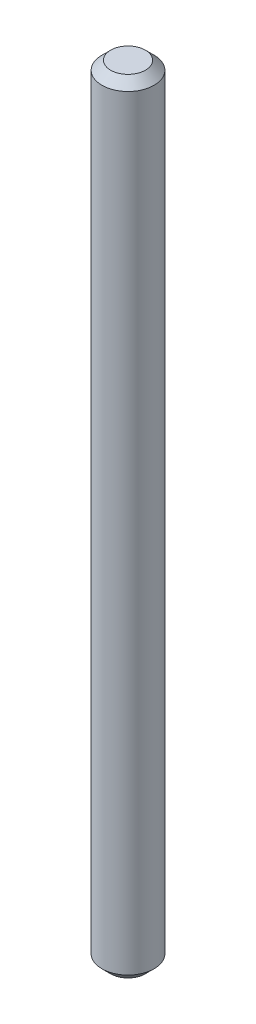
ISO-10303-21;
HEADER;
FILE_DESCRIPTION(('STEP AP214'),'2;1');
FILE_NAME('part.step','',(''),(''),'','','');
FILE_SCHEMA(('AUTOMOTIVE_DESIGN { 1 0 10303 214 1 1 1 1 }'));
ENDSEC;
DATA;
#1=APPLICATION_CONTEXT('core data for automotive mechanical design processes');
#2=APPLICATION_PROTOCOL_DEFINITION('international standard','automotive_design',2000,#1);
#3=PRODUCT_CONTEXT('',#1,'mechanical');
#4=PRODUCT('Part','Part','',(#3));
#5=PRODUCT_RELATED_PRODUCT_CATEGORY('part','',(#4));
#6=PRODUCT_DEFINITION_FORMATION('','',#4);
#7=PRODUCT_DEFINITION_CONTEXT('part definition',#1,'design');
#8=PRODUCT_DEFINITION('design','',#6,#7);
#9=PRODUCT_DEFINITION_SHAPE('','',#8);
#10=(LENGTH_UNIT() NAMED_UNIT(*) SI_UNIT(.MILLI.,.METRE.));
#11=(NAMED_UNIT(*) PLANE_ANGLE_UNIT() SI_UNIT($,.RADIAN.));
#12=(NAMED_UNIT(*) SI_UNIT($,.STERADIAN.) SOLID_ANGLE_UNIT());
#13=UNCERTAINTY_MEASURE_WITH_UNIT(LENGTH_MEASURE(1.E-05),#10,'distance_accuracy_value','');
#14=(GEOMETRIC_REPRESENTATION_CONTEXT(3) GLOBAL_UNCERTAINTY_ASSIGNED_CONTEXT((#13)) GLOBAL_UNIT_ASSIGNED_CONTEXT((#10,
#11,#12)) REPRESENTATION_CONTEXT('',''));
#15=CARTESIAN_POINT('',(0.,0.,0.));
#16=DIRECTION('',(0.,0.,1.));
#17=DIRECTION('',(1.,0.,0.));
#18=AXIS2_PLACEMENT_3D('',#15,#16,#17);
#19=CARTESIAN_POINT('',(0.,90.,0.));
#20=DIRECTION('',(0.,-1.,0.));
#21=DIRECTION('',(0.,0.,-1.));
#22=AXIS2_PLACEMENT_3D('',#19,#20,#21);
#23=CYLINDRICAL_SURFACE('',#22,3.);
#24=CARTESIAN_POINT('',(0.,1.00000000000006,0.));
#25=DIRECTION('',(0.,1.,0.));
#26=DIRECTION('',(0.,0.,1.));
#27=AXIS2_PLACEMENT_3D('',#24,#25,#26);
#28=CIRCLE('',#27,3.);
#29=CARTESIAN_POINT('',(0.,1.00000000000004,-3.));
#30=VERTEX_POINT('',#29);
#31=EDGE_CURVE('E50',#30,#30,#28,.T.);
#32=CARTESIAN_POINT('',(0.,89.,0.));
#33=DIRECTION('',(0.,1.,0.));
#34=DIRECTION('',(0.,0.,1.));
#35=AXIS2_PLACEMENT_3D('',#32,#33,#34);
#36=CIRCLE('',#35,3.);
#37=CARTESIAN_POINT('',(0.,89.,-3.));
#38=VERTEX_POINT('',#37);
#39=EDGE_CURVE('E55',#38,#38,#36,.F.);
#40=CARTESIAN_POINT('',(0.,1.00000000000004,-3.));
#41=CARTESIAN_POINT('',(0.,1.91666666666671,-3.));
#42=CARTESIAN_POINT('',(0.,2.83333333333338,-3.));
#43=CARTESIAN_POINT('',(0.,4.66666666666671,-3.));
#44=CARTESIAN_POINT('',(0.,5.58333333333338,-3.));
#45=CARTESIAN_POINT('',(0.,7.41666666666671,-3.));
#46=CARTESIAN_POINT('',(0.,8.33333333333338,-3.));
#47=CARTESIAN_POINT('',(0.,10.1666666666667,-3.));
#48=CARTESIAN_POINT('',(0.,11.0833333333334,-3.));
#49=CARTESIAN_POINT('',(0.,12.9166666666667,-3.));
#50=CARTESIAN_POINT('',(0.,13.8333333333334,-3.));
#51=CARTESIAN_POINT('',(0.,15.6666666666667,-3.));
#52=CARTESIAN_POINT('',(0.,16.5833333333334,-3.));
#53=CARTESIAN_POINT('',(0.,18.4166666666667,-3.));
#54=CARTESIAN_POINT('',(0.,19.3333333333334,-3.));
#55=CARTESIAN_POINT('',(0.,21.1666666666667,-3.));
#56=CARTESIAN_POINT('',(0.,22.0833333333334,-3.));
#57=CARTESIAN_POINT('',(0.,23.9166666666667,-3.));
#58=CARTESIAN_POINT('',(0.,24.8333333333334,-3.));
#59=CARTESIAN_POINT('',(0.,26.6666666666667,-3.));
#60=CARTESIAN_POINT('',(0.,27.5833333333334,-3.));
#61=CARTESIAN_POINT('',(0.,29.4166666666667,-3.));
#62=CARTESIAN_POINT('',(0.,30.3333333333334,-3.));
#63=CARTESIAN_POINT('',(0.,32.1666666666667,-3.));
#64=CARTESIAN_POINT('',(0.,33.0833333333334,-3.));
#65=CARTESIAN_POINT('',(0.,34.9166666666667,-3.));
#66=CARTESIAN_POINT('',(0.,35.8333333333334,-3.));
#67=CARTESIAN_POINT('',(0.,37.6666666666667,-3.));
#68=CARTESIAN_POINT('',(0.,38.5833333333334,-3.));
#69=CARTESIAN_POINT('',(0.,40.4166666666667,-3.));
#70=CARTESIAN_POINT('',(0.,41.3333333333334,-3.));
#71=CARTESIAN_POINT('',(0.,43.1666666666667,-3.));
#72=CARTESIAN_POINT('',(0.,44.0833333333334,-3.));
#73=CARTESIAN_POINT('',(0.,45.9166666666667,-3.));
#74=CARTESIAN_POINT('',(0.,46.8333333333334,-3.));
#75=CARTESIAN_POINT('',(0.,48.6666666666667,-3.));
#76=CARTESIAN_POINT('',(0.,49.5833333333334,-3.));
#77=CARTESIAN_POINT('',(0.,51.4166666666667,-3.));
#78=CARTESIAN_POINT('',(0.,52.3333333333334,-3.));
#79=CARTESIAN_POINT('',(0.,54.1666666666667,-3.));
#80=CARTESIAN_POINT('',(0.,55.0833333333334,-3.));
#81=CARTESIAN_POINT('',(0.,56.9166666666667,-3.));
#82=CARTESIAN_POINT('',(0.,57.8333333333334,-3.));
#83=CARTESIAN_POINT('',(0.,59.6666666666667,-3.));
#84=CARTESIAN_POINT('',(0.,60.5833333333334,-3.));
#85=CARTESIAN_POINT('',(0.,62.4166666666667,-3.));
#86=CARTESIAN_POINT('',(0.,63.3333333333334,-3.));
#87=CARTESIAN_POINT('',(0.,65.1666666666667,-3.));
#88=CARTESIAN_POINT('',(0.,66.0833333333334,-3.));
#89=CARTESIAN_POINT('',(0.,67.9166666666667,-3.));
#90=CARTESIAN_POINT('',(0.,68.8333333333334,-3.));
#91=CARTESIAN_POINT('',(0.,70.6666666666667,-3.));
#92=CARTESIAN_POINT('',(0.,71.5833333333334,-3.));
#93=CARTESIAN_POINT('',(0.,73.4166666666667,-3.));
#94=CARTESIAN_POINT('',(0.,74.3333333333334,-3.));
#95=CARTESIAN_POINT('',(0.,76.1666666666667,-3.));
#96=CARTESIAN_POINT('',(0.,77.0833333333334,-3.));
#97=CARTESIAN_POINT('',(0.,78.9166666666667,-3.));
#98=CARTESIAN_POINT('',(0.,79.8333333333334,-3.));
#99=CARTESIAN_POINT('',(0.,81.6666666666667,-3.));
#100=CARTESIAN_POINT('',(0.,82.5833333333334,-3.));
#101=CARTESIAN_POINT('',(0.,84.4166666666667,-3.));
#102=CARTESIAN_POINT('',(0.,85.3333333333334,-3.));
#103=CARTESIAN_POINT('',(0.,87.1666666666667,-3.));
#104=CARTESIAN_POINT('',(0.,88.0833333333334,-3.));
#105=CARTESIAN_POINT('',(0.,89.,-3.));
#106=B_SPLINE_CURVE_WITH_KNOTS('',3,(#40,#41,#42,#43,#44,#45,#46,#47,#48,#49,#50,#51,#52,#53,
#54,#55,#56,#57,#58,#59,#60,#61,#62,#63,#64,#65,#66,#67,#68,#69,#70,#71,#72,#73,#74,#75,#76,#77,
#78,#79,#80,#81,#82,#83,#84,#85,#86,#87,#88,#89,#90,#91,#92,#93,#94,#95,#96,#97,#98,#99,#100,
#101,#102,#103,#104,#105),.UNSPECIFIED.,.F.,.F.,(4,2,2,2,2,2,2,2,2,2,2,2,2,2,2,2,2,2,2,2,2,2,2,
2,2,2,2,2,2,2,2,2,4),(0.,2.75,5.50000000000001,8.25000000000001,11.,13.75,16.5,19.25,22.,24.75,
27.5,30.25,33.,35.75,38.5,41.25,44.,46.75,49.5,52.25,55.,57.75,60.5,63.25,66.,68.75,71.5,74.25,
77.,79.75,82.5,85.25,88.),.UNSPECIFIED.);
#107=EDGE_CURVE('BSEAM37',#30,#38,#106,.T.);
#108=ORIENTED_EDGE('',*,*,#31,.T.);
#109=ORIENTED_EDGE('',*,*,#39,.T.);
#110=ORIENTED_EDGE('',*,*,#107,.T.);
#111=ORIENTED_EDGE('',*,*,#107,.F.);
#112=EDGE_LOOP('',(#108,#110,#109,#111));
#113=FACE_BOUND('',#112,.T.);
#114=ADVANCED_FACE('F37',(#113),#23,.T.);
#115=CARTESIAN_POINT('',(0.,90.,0.));
#116=DIRECTION('',(0.,1.,0.));
#117=DIRECTION('',(0.,0.,1.));
#118=AXIS2_PLACEMENT_3D('',#115,#116,#117);
#119=PLANE('',#118);
#120=CARTESIAN_POINT('',(0.,90.,0.));
#121=DIRECTION('',(0.,1.,0.));
#122=DIRECTION('',(0.,0.,1.));
#123=AXIS2_PLACEMENT_3D('',#120,#121,#122);
#124=CIRCLE('',#123,2.00000000000006);
#125=CARTESIAN_POINT('',(0.,90.,2.00000000000006));
#126=VERTEX_POINT('',#125);
#127=EDGE_CURVE('E10',#126,#126,#124,.T.);
#128=ORIENTED_EDGE('',*,*,#127,.T.);
#129=EDGE_LOOP('',(#128));
#130=FACE_BOUND('',#129,.T.);
#131=ADVANCED_FACE('F72',(#130),#119,.T.);
#132=CARTESIAN_POINT('',(0.,0.,0.));
#133=DIRECTION('',(0.,1.,0.));
#134=DIRECTION('',(0.,0.,1.));
#135=AXIS2_PLACEMENT_3D('',#132,#133,#134);
#136=PLANE('',#135);
#137=CARTESIAN_POINT('',(0.,0.,0.));
#138=DIRECTION('',(0.,1.,0.));
#139=DIRECTION('',(0.,0.,1.));
#140=AXIS2_PLACEMENT_3D('',#137,#138,#139);
#141=CIRCLE('',#140,1.99999999999994);
#142=CARTESIAN_POINT('',(0.,0.,1.99999999999994));
#143=VERTEX_POINT('',#142);
#144=EDGE_CURVE('E45',#143,#143,#141,.F.);
#145=ORIENTED_EDGE('',*,*,#144,.T.);
#146=EDGE_LOOP('',(#145));
#147=FACE_BOUND('',#146,.T.);
#148=ADVANCED_FACE('F69',(#147),#136,.F.);
#149=CARTESIAN_POINT('',(0.,1.00000000000006,0.));
#150=DIRECTION('',(0.,1.,0.));
#151=DIRECTION('',(0.,0.,1.));
#152=AXIS2_PLACEMENT_3D('',#149,#150,#151);
#153=CONICAL_SURFACE('',#152,3.,0.785398163397451);
#154=ORIENTED_EDGE('',*,*,#144,.F.);
#155=EDGE_LOOP('',(#154));
#156=FACE_BOUND('',#155,.T.);
#157=ORIENTED_EDGE('',*,*,#31,.F.);
#158=EDGE_LOOP('',(#157));
#159=FACE_BOUND('',#158,.T.);
#160=ADVANCED_FACE('F65',(#156,#159),#153,.T.);
#161=CARTESIAN_POINT('',(0.,90.,0.));
#162=DIRECTION('',(0.,-1.,0.));
#163=DIRECTION('',(0.,0.,-1.));
#164=AXIS2_PLACEMENT_3D('',#161,#162,#163);
#165=CONICAL_SURFACE('',#164,2.00000000000006,0.785398163397441);
#166=ORIENTED_EDGE('',*,*,#39,.F.);
#167=EDGE_LOOP('',(#166));
#168=FACE_BOUND('',#167,.T.);
#169=ORIENTED_EDGE('',*,*,#127,.F.);
#170=EDGE_LOOP('',(#169));
#171=FACE_BOUND('',#170,.T.);
#172=ADVANCED_FACE('F39',(#168,#171),#165,.T.);
#173=CLOSED_SHELL('',(#114,#131,#148,#160,#172));
#174=MANIFOLD_SOLID_BREP('B2',#173);
#175=ADVANCED_BREP_SHAPE_REPRESENTATION('',(#18,#174),#14);
#176=SHAPE_DEFINITION_REPRESENTATION(#9,#175);
ENDSEC;
END-ISO-10303-21;
